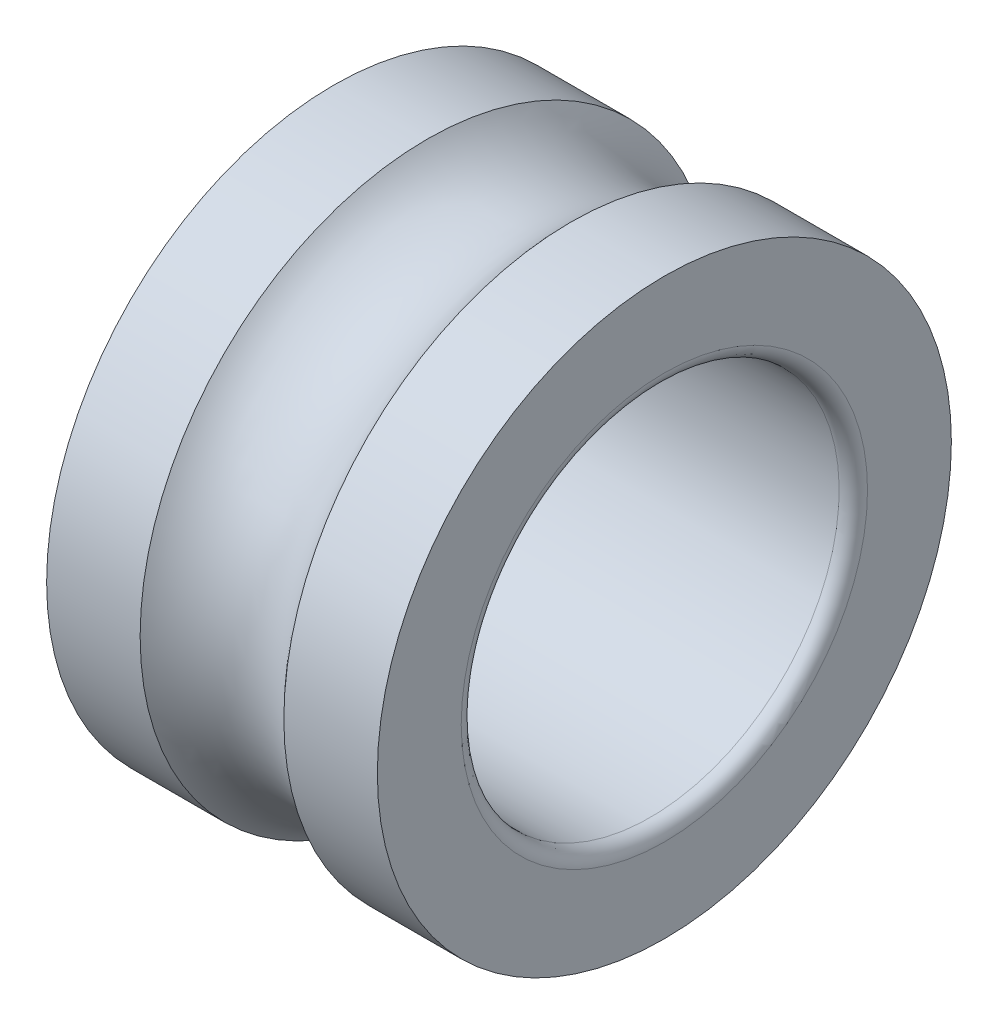
ISO-10303-21;
HEADER;
FILE_DESCRIPTION(('STEP AP214'),'2;1');
FILE_NAME('part.step','',(''),(''),'','','');
FILE_SCHEMA(('AUTOMOTIVE_DESIGN { 1 0 10303 214 1 1 1 1 }'));
ENDSEC;
DATA;
#1=APPLICATION_CONTEXT('core data for automotive mechanical design processes');
#2=APPLICATION_PROTOCOL_DEFINITION('international standard','automotive_design',2000,#1);
#3=PRODUCT_CONTEXT('',#1,'mechanical');
#4=PRODUCT('Part','Part','',(#3));
#5=PRODUCT_RELATED_PRODUCT_CATEGORY('part','',(#4));
#6=PRODUCT_DEFINITION_FORMATION('','',#4);
#7=PRODUCT_DEFINITION_CONTEXT('part definition',#1,'design');
#8=PRODUCT_DEFINITION('design','',#6,#7);
#9=PRODUCT_DEFINITION_SHAPE('','',#8);
#10=(LENGTH_UNIT() NAMED_UNIT(*) SI_UNIT(.MILLI.,.METRE.));
#11=(NAMED_UNIT(*) PLANE_ANGLE_UNIT() SI_UNIT($,.RADIAN.));
#12=(NAMED_UNIT(*) SI_UNIT($,.STERADIAN.) SOLID_ANGLE_UNIT());
#13=UNCERTAINTY_MEASURE_WITH_UNIT(LENGTH_MEASURE(1.E-05),#10,'distance_accuracy_value','');
#14=(GEOMETRIC_REPRESENTATION_CONTEXT(3) GLOBAL_UNCERTAINTY_ASSIGNED_CONTEXT((#13)) GLOBAL_UNIT_ASSIGNED_CONTEXT((#10,
#11,#12)) REPRESENTATION_CONTEXT('',''));
#15=CARTESIAN_POINT('',(0.,0.,0.));
#16=DIRECTION('',(0.,0.,1.));
#17=DIRECTION('',(1.,0.,0.));
#18=AXIS2_PLACEMENT_3D('',#15,#16,#17);
#19=CARTESIAN_POINT('',(6.0103642630345,0.,0.));
#20=DIRECTION('',(-1.,0.,0.));
#21=DIRECTION('',(0.,1.,0.));
#22=AXIS2_PLACEMENT_3D('',#19,#20,#21);
#23=CYLINDRICAL_SURFACE('',#22,6.075);
#24=CARTESIAN_POINT('',(5.020728526069,0.,0.));
#25=DIRECTION('',(-1.,0.,0.));
#26=DIRECTION('',(0.,1.,0.));
#27=AXIS2_PLACEMENT_3D('',#24,#25,#26);
#28=CIRCLE('',#27,6.075);
#29=CARTESIAN_POINT('',(5.020728526069,6.075,0.));
#30=VERTEX_POINT('',#29);
#31=EDGE_CURVE('E11',#30,#30,#28,.T.);
#32=ORIENTED_EDGE('',*,*,#31,.F.);
#33=EDGE_LOOP('',(#32));
#34=FACE_BOUND('',#33,.T.);
#35=CARTESIAN_POINT('',(7.,0.,0.));
#36=DIRECTION('',(-1.,0.,0.));
#37=DIRECTION('',(0.,1.,0.));
#38=AXIS2_PLACEMENT_3D('',#35,#36,#37);
#39=CIRCLE('',#38,6.075);
#40=CARTESIAN_POINT('',(7.,6.075,0.));
#41=VERTEX_POINT('',#40);
#42=EDGE_CURVE('E70',#41,#41,#39,.T.);
#43=ORIENTED_EDGE('',*,*,#42,.T.);
#44=EDGE_LOOP('',(#43));
#45=FACE_BOUND('',#44,.T.);
#46=ADVANCED_FACE('F35',(#34,#45),#23,.T.);
#47=CARTESIAN_POINT('',(3.5,0.,0.));
#48=DIRECTION('',(1.,0.,0.));
#49=DIRECTION('',(0.,0.,1.));
#50=AXIS2_PLACEMENT_3D('',#47,#48,#49);
#51=TOROIDAL_SURFACE('',#50,7.35,1.9845);
#52=CARTESIAN_POINT('',(1.979271473931,0.,0.));
#53=DIRECTION('',(-1.,0.,0.));
#54=DIRECTION('',(0.,1.,0.));
#55=AXIS2_PLACEMENT_3D('',#52,#53,#54);
#56=CIRCLE('',#55,6.075);
#57=CARTESIAN_POINT('',(1.979271473931,6.075,0.));
#58=VERTEX_POINT('',#57);
#59=EDGE_CURVE('E43',#58,#58,#56,.T.);
#60=ORIENTED_EDGE('',*,*,#59,.F.);
#61=EDGE_LOOP('',(#60));
#62=FACE_BOUND('',#61,.T.);
#63=ORIENTED_EDGE('',*,*,#31,.T.);
#64=EDGE_LOOP('',(#63));
#65=FACE_BOUND('',#64,.T.);
#66=ADVANCED_FACE('F105',(#62,#65),#51,.F.);
#67=CARTESIAN_POINT('',(0.989635736965498,0.,0.));
#68=DIRECTION('',(-1.,0.,0.));
#69=DIRECTION('',(0.,1.,0.));
#70=AXIS2_PLACEMENT_3D('',#67,#68,#69);
#71=CYLINDRICAL_SURFACE('',#70,6.075);
#72=CARTESIAN_POINT('',(0.,0.,0.));
#73=DIRECTION('',(-1.,0.,0.));
#74=DIRECTION('',(0.,1.,0.));
#75=AXIS2_PLACEMENT_3D('',#72,#73,#74);
#76=CIRCLE('',#75,6.075);
#77=CARTESIAN_POINT('',(0.,6.075,0.));
#78=VERTEX_POINT('',#77);
#79=EDGE_CURVE('E78',#78,#78,#76,.T.);
#80=ORIENTED_EDGE('',*,*,#79,.F.);
#81=EDGE_LOOP('',(#80));
#82=FACE_BOUND('',#81,.T.);
#83=ORIENTED_EDGE('',*,*,#59,.T.);
#84=EDGE_LOOP('',(#83));
#85=FACE_BOUND('',#84,.T.);
#86=ADVANCED_FACE('F99',(#82,#85),#71,.T.);
#87=CARTESIAN_POINT('',(0.,5.1875,0.));
#88=DIRECTION('',(-1.,0.,0.));
#89=DIRECTION('',(0.,-1.,0.));
#90=AXIS2_PLACEMENT_3D('',#87,#88,#89);
#91=PLANE('',#90);
#92=CARTESIAN_POINT('',(0.,0.,0.));
#93=DIRECTION('',(-1.,0.,0.));
#94=DIRECTION('',(0.,1.,0.));
#95=AXIS2_PLACEMENT_3D('',#92,#93,#94);
#96=CIRCLE('',#95,4.3);
#97=CARTESIAN_POINT('',(0.,4.3,0.));
#98=VERTEX_POINT('',#97);
#99=EDGE_CURVE('E81',#98,#98,#96,.T.);
#100=ORIENTED_EDGE('',*,*,#99,.F.);
#101=EDGE_LOOP('',(#100));
#102=FACE_BOUND('',#101,.T.);
#103=ORIENTED_EDGE('',*,*,#79,.T.);
#104=EDGE_LOOP('',(#103));
#105=FACE_BOUND('',#104,.T.);
#106=ADVANCED_FACE('F90',(#102,#105),#91,.T.);
#107=CARTESIAN_POINT('',(0.3,0.,0.));
#108=DIRECTION('',(1.,0.,0.));
#109=DIRECTION('',(0.,0.,1.));
#110=AXIS2_PLACEMENT_3D('',#107,#108,#109);
#111=TOROIDAL_SURFACE('',#110,4.3,0.3);
#112=CARTESIAN_POINT('',(0.3,0.,0.));
#113=DIRECTION('',(-1.,0.,0.));
#114=DIRECTION('',(0.,1.,0.));
#115=AXIS2_PLACEMENT_3D('',#112,#113,#114);
#116=CIRCLE('',#115,4.);
#117=CARTESIAN_POINT('',(0.3,4.,0.));
#118=VERTEX_POINT('',#117);
#119=EDGE_CURVE('E38',#118,#118,#116,.T.);
#120=ORIENTED_EDGE('',*,*,#119,.F.);
#121=EDGE_LOOP('',(#120));
#122=FACE_BOUND('',#121,.T.);
#123=ORIENTED_EDGE('',*,*,#99,.T.);
#124=EDGE_LOOP('',(#123));
#125=FACE_BOUND('',#124,.T.);
#126=ADVANCED_FACE('F88',(#122,#125),#111,.T.);
#127=CARTESIAN_POINT('',(3.5,0.,0.));
#128=DIRECTION('',(-1.,0.,0.));
#129=DIRECTION('',(0.,1.,0.));
#130=AXIS2_PLACEMENT_3D('',#127,#128,#129);
#131=CYLINDRICAL_SURFACE('',#130,4.);
#132=CARTESIAN_POINT('',(6.7,0.,0.));
#133=DIRECTION('',(-1.,0.,0.));
#134=DIRECTION('',(0.,1.,0.));
#135=AXIS2_PLACEMENT_3D('',#132,#133,#134);
#136=CIRCLE('',#135,4.);
#137=CARTESIAN_POINT('',(6.7,4.,0.));
#138=VERTEX_POINT('',#137);
#139=EDGE_CURVE('E72',#138,#138,#136,.T.);
#140=ORIENTED_EDGE('',*,*,#139,.F.);
#141=EDGE_LOOP('',(#140));
#142=FACE_BOUND('',#141,.T.);
#143=ORIENTED_EDGE('',*,*,#119,.T.);
#144=EDGE_LOOP('',(#143));
#145=FACE_BOUND('',#144,.T.);
#146=ADVANCED_FACE('F86',(#142,#145),#131,.F.);
#147=CARTESIAN_POINT('',(6.7,0.,0.));
#148=DIRECTION('',(1.,0.,0.));
#149=DIRECTION('',(0.,0.,1.));
#150=AXIS2_PLACEMENT_3D('',#147,#148,#149);
#151=TOROIDAL_SURFACE('',#150,4.3,0.3);
#152=CARTESIAN_POINT('',(7.,0.,0.));
#153=DIRECTION('',(-1.,0.,0.));
#154=DIRECTION('',(0.,1.,0.));
#155=AXIS2_PLACEMENT_3D('',#152,#153,#154);
#156=CIRCLE('',#155,4.3);
#157=CARTESIAN_POINT('',(7.,4.3,0.));
#158=VERTEX_POINT('',#157);
#159=EDGE_CURVE('E73',#158,#158,#156,.T.);
#160=ORIENTED_EDGE('',*,*,#159,.F.);
#161=EDGE_LOOP('',(#160));
#162=FACE_BOUND('',#161,.T.);
#163=ORIENTED_EDGE('',*,*,#139,.T.);
#164=EDGE_LOOP('',(#163));
#165=FACE_BOUND('',#164,.T.);
#166=ADVANCED_FACE('F96',(#162,#165),#151,.T.);
#167=CARTESIAN_POINT('',(7.,5.1875,0.));
#168=DIRECTION('',(1.,0.,0.));
#169=DIRECTION('',(0.,1.,0.));
#170=AXIS2_PLACEMENT_3D('',#167,#168,#169);
#171=PLANE('',#170);
#172=ORIENTED_EDGE('',*,*,#42,.F.);
#173=EDGE_LOOP('',(#172));
#174=FACE_BOUND('',#173,.T.);
#175=ORIENTED_EDGE('',*,*,#159,.T.);
#176=EDGE_LOOP('',(#175));
#177=FACE_BOUND('',#176,.T.);
#178=ADVANCED_FACE('F116',(#174,#177),#171,.T.);
#179=CLOSED_SHELL('',(#46,#66,#86,#106,#126,#146,#166,#178));
#180=MANIFOLD_SOLID_BREP('B2',#179);
#181=ADVANCED_BREP_SHAPE_REPRESENTATION('',(#18,#180),#14);
#182=SHAPE_DEFINITION_REPRESENTATION(#9,#181);
ENDSEC;
END-ISO-10303-21;
